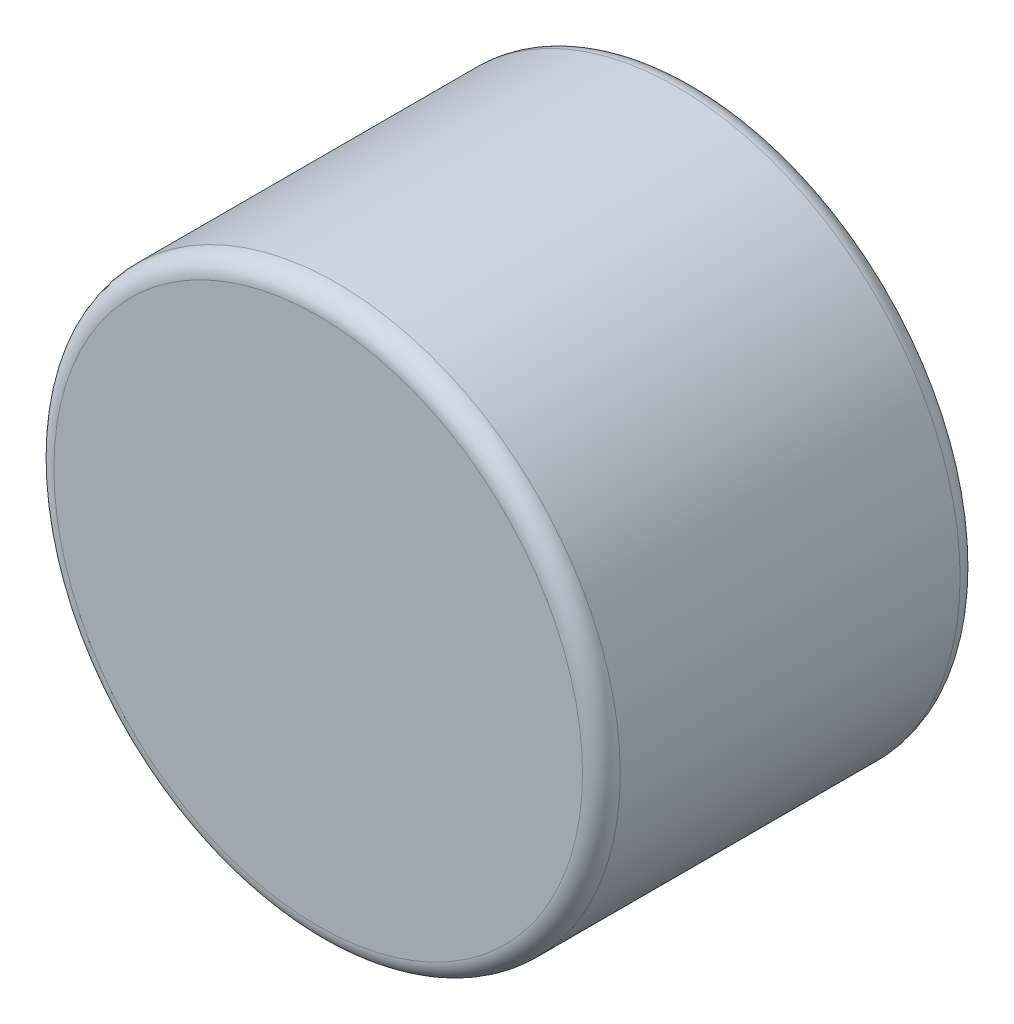
ISO-10303-21;
HEADER;
FILE_DESCRIPTION(('STEP AP214'),'2;1');
FILE_NAME('part.step','',(''),(''),'','','');
FILE_SCHEMA(('AUTOMOTIVE_DESIGN { 1 0 10303 214 1 1 1 1 }'));
ENDSEC;
DATA;
#1=APPLICATION_CONTEXT('core data for automotive mechanical design processes');
#2=APPLICATION_PROTOCOL_DEFINITION('international standard','automotive_design',2000,#1);
#3=PRODUCT_CONTEXT('',#1,'mechanical');
#4=PRODUCT('Part','Part','',(#3));
#5=PRODUCT_RELATED_PRODUCT_CATEGORY('part','',(#4));
#6=PRODUCT_DEFINITION_FORMATION('','',#4);
#7=PRODUCT_DEFINITION_CONTEXT('part definition',#1,'design');
#8=PRODUCT_DEFINITION('design','',#6,#7);
#9=PRODUCT_DEFINITION_SHAPE('','',#8);
#10=(LENGTH_UNIT() NAMED_UNIT(*) SI_UNIT(.MILLI.,.METRE.));
#11=(NAMED_UNIT(*) PLANE_ANGLE_UNIT() SI_UNIT($,.RADIAN.));
#12=(NAMED_UNIT(*) SI_UNIT($,.STERADIAN.) SOLID_ANGLE_UNIT());
#13=UNCERTAINTY_MEASURE_WITH_UNIT(LENGTH_MEASURE(1.E-05),#10,'distance_accuracy_value','');
#14=(GEOMETRIC_REPRESENTATION_CONTEXT(3) GLOBAL_UNCERTAINTY_ASSIGNED_CONTEXT((#13)) GLOBAL_UNIT_ASSIGNED_CONTEXT((#10,
#11,#12)) REPRESENTATION_CONTEXT('',''));
#15=CARTESIAN_POINT('',(0.,0.,0.));
#16=DIRECTION('',(0.,0.,1.));
#17=DIRECTION('',(1.,0.,0.));
#18=AXIS2_PLACEMENT_3D('',#15,#16,#17);
#19=CARTESIAN_POINT('',(0.,0.,50.8));
#20=DIRECTION('',(0.,0.,-1.));
#21=DIRECTION('',(-1.,0.,0.));
#22=AXIS2_PLACEMENT_3D('',#19,#20,#21);
#23=CYLINDRICAL_SURFACE('',#22,38.1);
#24=CARTESIAN_POINT('',(0.,0.,2.54));
#25=DIRECTION('',(0.,0.,1.));
#26=DIRECTION('',(1.,0.,0.));
#27=AXIS2_PLACEMENT_3D('',#24,#25,#26);
#28=CIRCLE('',#27,38.1);
#29=CARTESIAN_POINT('',(38.1,0.,2.54));
#30=VERTEX_POINT('',#29);
#31=EDGE_CURVE('E40',#30,#30,#28,.T.);
#32=ORIENTED_EDGE('',*,*,#31,.T.);
#33=EDGE_LOOP('',(#32));
#34=FACE_BOUND('',#33,.T.);
#35=CARTESIAN_POINT('',(0.,0.,48.26));
#36=DIRECTION('',(0.,0.,1.));
#37=DIRECTION('',(1.,0.,0.));
#38=AXIS2_PLACEMENT_3D('',#35,#36,#37);
#39=CIRCLE('',#38,38.1);
#40=CARTESIAN_POINT('',(38.1,0.,48.26));
#41=VERTEX_POINT('',#40);
#42=EDGE_CURVE('E44',#41,#41,#39,.F.);
#43=ORIENTED_EDGE('',*,*,#42,.T.);
#44=EDGE_LOOP('',(#43));
#45=FACE_BOUND('',#44,.T.);
#46=ADVANCED_FACE('F29',(#34,#45),#23,.T.);
#47=CARTESIAN_POINT('',(0.,0.,50.8));
#48=DIRECTION('',(0.,0.,1.));
#49=DIRECTION('',(1.,0.,0.));
#50=AXIS2_PLACEMENT_3D('',#47,#48,#49);
#51=PLANE('',#50);
#52=CARTESIAN_POINT('',(0.,0.,50.8));
#53=DIRECTION('',(0.,0.,1.));
#54=DIRECTION('',(1.,0.,0.));
#55=AXIS2_PLACEMENT_3D('',#52,#53,#54);
#56=CIRCLE('',#55,35.56);
#57=CARTESIAN_POINT('',(35.56,0.,50.8));
#58=VERTEX_POINT('',#57);
#59=EDGE_CURVE('E10',#58,#58,#56,.T.);
#60=ORIENTED_EDGE('',*,*,#59,.T.);
#61=EDGE_LOOP('',(#60));
#62=FACE_BOUND('',#61,.T.);
#63=ADVANCED_FACE('F60',(#62),#51,.T.);
#64=CARTESIAN_POINT('',(0.,0.,0.));
#65=DIRECTION('',(0.,0.,1.));
#66=DIRECTION('',(1.,0.,0.));
#67=AXIS2_PLACEMENT_3D('',#64,#65,#66);
#68=PLANE('',#67);
#69=CARTESIAN_POINT('',(0.,0.,0.));
#70=DIRECTION('',(0.,0.,1.));
#71=DIRECTION('',(1.,0.,0.));
#72=AXIS2_PLACEMENT_3D('',#69,#70,#71);
#73=CIRCLE('',#72,35.56);
#74=CARTESIAN_POINT('',(35.56,0.,0.));
#75=VERTEX_POINT('',#74);
#76=EDGE_CURVE('E36',#75,#75,#73,.F.);
#77=ORIENTED_EDGE('',*,*,#76,.T.);
#78=EDGE_LOOP('',(#77));
#79=FACE_BOUND('',#78,.T.);
#80=ADVANCED_FACE('F57',(#79),#68,.F.);
#81=CARTESIAN_POINT('',(0.,0.,2.54));
#82=DIRECTION('',(0.,0.,1.));
#83=DIRECTION('',(1.,0.,0.));
#84=AXIS2_PLACEMENT_3D('',#81,#82,#83);
#85=TOROIDAL_SURFACE('',#84,35.56,2.54);
#86=ORIENTED_EDGE('',*,*,#76,.F.);
#87=EDGE_LOOP('',(#86));
#88=FACE_BOUND('',#87,.T.);
#89=ORIENTED_EDGE('',*,*,#31,.F.);
#90=EDGE_LOOP('',(#89));
#91=FACE_BOUND('',#90,.T.);
#92=ADVANCED_FACE('F53',(#88,#91),#85,.T.);
#93=CARTESIAN_POINT('',(0.,0.,48.26));
#94=DIRECTION('',(0.,0.,1.));
#95=DIRECTION('',(1.,0.,0.));
#96=AXIS2_PLACEMENT_3D('',#93,#94,#95);
#97=TOROIDAL_SURFACE('',#96,35.56,2.54);
#98=ORIENTED_EDGE('',*,*,#42,.F.);
#99=EDGE_LOOP('',(#98));
#100=FACE_BOUND('',#99,.T.);
#101=ORIENTED_EDGE('',*,*,#59,.F.);
#102=EDGE_LOOP('',(#101));
#103=FACE_BOUND('',#102,.T.);
#104=ADVANCED_FACE('F31',(#100,#103),#97,.T.);
#105=CLOSED_SHELL('',(#46,#63,#80,#92,#104));
#106=MANIFOLD_SOLID_BREP('B2',#105);
#107=ADVANCED_BREP_SHAPE_REPRESENTATION('',(#18,#106),#14);
#108=SHAPE_DEFINITION_REPRESENTATION(#9,#107);
ENDSEC;
END-ISO-10303-21;
